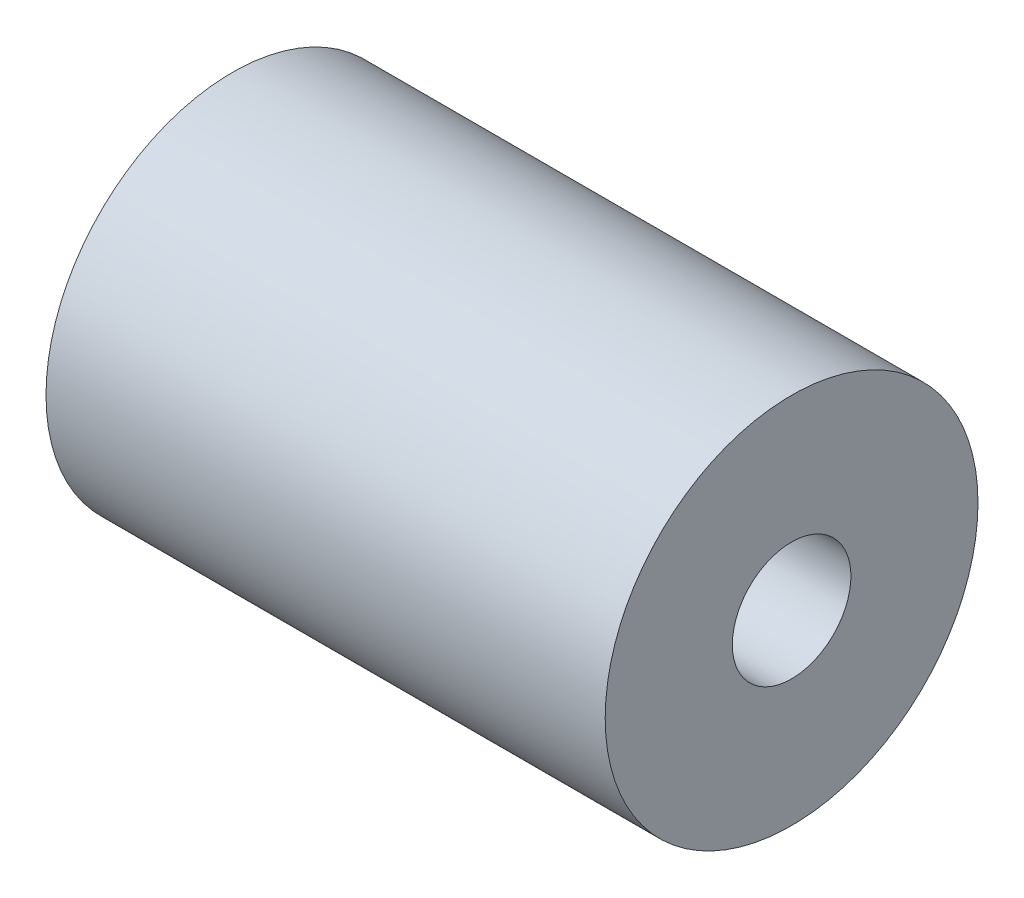
ISO-10303-21;
HEADER;
FILE_DESCRIPTION(('STEP AP214'),'2;1');
FILE_NAME('part.step','',(''),(''),'','','');
FILE_SCHEMA(('AUTOMOTIVE_DESIGN { 1 0 10303 214 1 1 1 1 }'));
ENDSEC;
DATA;
#1=APPLICATION_CONTEXT('core data for automotive mechanical design processes');
#2=APPLICATION_PROTOCOL_DEFINITION('international standard','automotive_design',2000,#1);
#3=PRODUCT_CONTEXT('',#1,'mechanical');
#4=PRODUCT('Part','Part','',(#3));
#5=PRODUCT_RELATED_PRODUCT_CATEGORY('part','',(#4));
#6=PRODUCT_DEFINITION_FORMATION('','',#4);
#7=PRODUCT_DEFINITION_CONTEXT('part definition',#1,'design');
#8=PRODUCT_DEFINITION('design','',#6,#7);
#9=PRODUCT_DEFINITION_SHAPE('','',#8);
#10=(LENGTH_UNIT() NAMED_UNIT(*) SI_UNIT(.MILLI.,.METRE.));
#11=(NAMED_UNIT(*) PLANE_ANGLE_UNIT() SI_UNIT($,.RADIAN.));
#12=(NAMED_UNIT(*) SI_UNIT($,.STERADIAN.) SOLID_ANGLE_UNIT());
#13=UNCERTAINTY_MEASURE_WITH_UNIT(LENGTH_MEASURE(1.E-05),#10,'distance_accuracy_value','');
#14=(GEOMETRIC_REPRESENTATION_CONTEXT(3) GLOBAL_UNCERTAINTY_ASSIGNED_CONTEXT((#13)) GLOBAL_UNIT_ASSIGNED_CONTEXT((#10,
#11,#12)) REPRESENTATION_CONTEXT('',''));
#15=CARTESIAN_POINT('',(0.,0.,0.));
#16=DIRECTION('',(0.,0.,1.));
#17=DIRECTION('',(1.,0.,0.));
#18=AXIS2_PLACEMENT_3D('',#15,#16,#17);
#19=CARTESIAN_POINT('',(19.05,0.,0.));
#20=DIRECTION('',(1.,0.,0.));
#21=DIRECTION('',(0.,0.,-1.));
#22=AXIS2_PLACEMENT_3D('',#19,#20,#21);
#23=PLANE('',#22);
#24=CARTESIAN_POINT('',(19.05,0.,0.));
#25=DIRECTION('',(1.,0.,0.));
#26=DIRECTION('',(0.,0.,-1.));
#27=AXIS2_PLACEMENT_3D('',#24,#25,#26);
#28=CIRCLE('',#27,6.35);
#29=CARTESIAN_POINT('',(19.05,0.,6.35));
#30=VERTEX_POINT('',#29);
#31=EDGE_CURVE('E12',#30,#30,#28,.T.);
#32=ORIENTED_EDGE('',*,*,#31,.T.);
#33=EDGE_LOOP('',(#32));
#34=FACE_BOUND('',#33,.T.);
#35=CARTESIAN_POINT('',(19.05,0.,0.));
#36=DIRECTION('',(1.,0.,0.));
#37=DIRECTION('',(0.,0.,-1.));
#38=AXIS2_PLACEMENT_3D('',#35,#36,#37);
#39=CIRCLE('',#38,2.0193);
#40=CARTESIAN_POINT('',(19.05,0.,2.0193));
#41=VERTEX_POINT('',#40);
#42=EDGE_CURVE('E62',#41,#41,#39,.T.);
#43=ORIENTED_EDGE('',*,*,#42,.F.);
#44=EDGE_LOOP('',(#43));
#45=FACE_BOUND('',#44,.T.);
#46=ADVANCED_FACE('F48',(#34,#45),#23,.T.);
#47=CARTESIAN_POINT('',(0.,0.,0.));
#48=DIRECTION('',(1.,0.,0.));
#49=DIRECTION('',(0.,0.,-1.));
#50=AXIS2_PLACEMENT_3D('',#47,#48,#49);
#51=PLANE('',#50);
#52=CARTESIAN_POINT('',(0.,0.,0.));
#53=DIRECTION('',(1.,0.,0.));
#54=DIRECTION('',(0.,0.,-1.));
#55=AXIS2_PLACEMENT_3D('',#52,#53,#54);
#56=CIRCLE('',#55,6.35);
#57=CARTESIAN_POINT('',(0.,0.,6.35));
#58=VERTEX_POINT('',#57);
#59=EDGE_CURVE('E52',#58,#58,#56,.T.);
#60=ORIENTED_EDGE('',*,*,#59,.F.);
#61=EDGE_LOOP('',(#60));
#62=FACE_BOUND('',#61,.T.);
#63=CARTESIAN_POINT('',(0.,0.,0.));
#64=DIRECTION('',(1.,0.,0.));
#65=DIRECTION('',(0.,0.,-1.));
#66=AXIS2_PLACEMENT_3D('',#63,#64,#65);
#67=CIRCLE('',#66,2.0193);
#68=CARTESIAN_POINT('',(0.,0.,2.0193));
#69=VERTEX_POINT('',#68);
#70=EDGE_CURVE('E64',#69,#69,#67,.T.);
#71=ORIENTED_EDGE('',*,*,#70,.T.);
#72=EDGE_LOOP('',(#71));
#73=FACE_BOUND('',#72,.T.);
#74=ADVANCED_FACE('F77',(#62,#73),#51,.F.);
#75=CARTESIAN_POINT('',(19.05,0.,0.));
#76=DIRECTION('',(-1.,0.,0.));
#77=DIRECTION('',(0.,0.,1.));
#78=AXIS2_PLACEMENT_3D('',#75,#76,#77);
#79=CYLINDRICAL_SURFACE('',#78,6.35);
#80=CARTESIAN_POINT('',(19.05,0.,6.35));
#81=CARTESIAN_POINT('',(18.8515625,0.,6.35));
#82=CARTESIAN_POINT('',(18.653125,0.,6.35));
#83=CARTESIAN_POINT('',(18.25625,0.,6.35));
#84=CARTESIAN_POINT('',(18.0578125,0.,6.35));
#85=CARTESIAN_POINT('',(17.6609375,0.,6.35));
#86=CARTESIAN_POINT('',(17.4625,0.,6.35));
#87=CARTESIAN_POINT('',(17.065625,0.,6.35));
#88=CARTESIAN_POINT('',(16.8671875,0.,6.35));
#89=CARTESIAN_POINT('',(16.4703125,0.,6.35));
#90=CARTESIAN_POINT('',(16.271875,0.,6.35));
#91=CARTESIAN_POINT('',(15.875,0.,6.35));
#92=CARTESIAN_POINT('',(15.6765625,0.,6.35));
#93=CARTESIAN_POINT('',(15.2796875,0.,6.35));
#94=CARTESIAN_POINT('',(15.08125,0.,6.35));
#95=CARTESIAN_POINT('',(14.684375,0.,6.35));
#96=CARTESIAN_POINT('',(14.4859375,0.,6.35));
#97=CARTESIAN_POINT('',(14.0890625,0.,6.35));
#98=CARTESIAN_POINT('',(13.890625,0.,6.35));
#99=CARTESIAN_POINT('',(13.49375,0.,6.35));
#100=CARTESIAN_POINT('',(13.2953125,0.,6.35));
#101=CARTESIAN_POINT('',(12.8984375,0.,6.35));
#102=CARTESIAN_POINT('',(12.7,0.,6.35));
#103=CARTESIAN_POINT('',(12.303125,0.,6.35));
#104=CARTESIAN_POINT('',(12.1046875,0.,6.35));
#105=CARTESIAN_POINT('',(11.7078125,0.,6.35));
#106=CARTESIAN_POINT('',(11.509375,0.,6.35));
#107=CARTESIAN_POINT('',(11.1125,0.,6.35));
#108=CARTESIAN_POINT('',(10.9140625,0.,6.35));
#109=CARTESIAN_POINT('',(10.5171875,0.,6.35));
#110=CARTESIAN_POINT('',(10.31875,0.,6.35));
#111=CARTESIAN_POINT('',(9.921875,0.,6.35));
#112=CARTESIAN_POINT('',(9.7234375,0.,6.35));
#113=CARTESIAN_POINT('',(9.3265625,0.,6.35));
#114=CARTESIAN_POINT('',(9.128125,0.,6.35));
#115=CARTESIAN_POINT('',(8.73125,0.,6.35));
#116=CARTESIAN_POINT('',(8.5328125,0.,6.35));
#117=CARTESIAN_POINT('',(8.1359375,0.,6.35));
#118=CARTESIAN_POINT('',(7.9375,0.,6.35));
#119=CARTESIAN_POINT('',(7.540625,0.,6.35));
#120=CARTESIAN_POINT('',(7.3421875,0.,6.35));
#121=CARTESIAN_POINT('',(6.9453125,0.,6.35));
#122=CARTESIAN_POINT('',(6.746875,0.,6.35));
#123=CARTESIAN_POINT('',(6.35,0.,6.35));
#124=CARTESIAN_POINT('',(6.1515625,0.,6.35));
#125=CARTESIAN_POINT('',(5.7546875,0.,6.35));
#126=CARTESIAN_POINT('',(5.55625,0.,6.35));
#127=CARTESIAN_POINT('',(5.159375,0.,6.35));
#128=CARTESIAN_POINT('',(4.9609375,0.,6.35));
#129=CARTESIAN_POINT('',(4.5640625,0.,6.35));
#130=CARTESIAN_POINT('',(4.365625,0.,6.35));
#131=CARTESIAN_POINT('',(3.96875,0.,6.35));
#132=CARTESIAN_POINT('',(3.7703125,0.,6.35));
#133=CARTESIAN_POINT('',(3.3734375,0.,6.35));
#134=CARTESIAN_POINT('',(3.175,0.,6.35));
#135=CARTESIAN_POINT('',(2.778125,0.,6.35));
#136=CARTESIAN_POINT('',(2.5796875,0.,6.35));
#137=CARTESIAN_POINT('',(2.1828125,0.,6.35));
#138=CARTESIAN_POINT('',(1.984375,0.,6.35));
#139=CARTESIAN_POINT('',(1.5875,0.,6.35));
#140=CARTESIAN_POINT('',(1.3890625,0.,6.35));
#141=CARTESIAN_POINT('',(0.992187500000001,0.,6.35));
#142=CARTESIAN_POINT('',(0.793750000000001,0.,6.35));
#143=CARTESIAN_POINT('',(0.396875,0.,6.35));
#144=CARTESIAN_POINT('',(0.1984375,0.,6.35));
#145=CARTESIAN_POINT('',(0.,0.,6.35));
#146=B_SPLINE_CURVE_WITH_KNOTS('',3,(#80,#81,#82,#83,#84,#85,#86,#87,#88,#89,#90,#91,#92,#93,
#94,#95,#96,#97,#98,#99,#100,#101,#102,#103,#104,#105,#106,#107,#108,#109,#110,#111,#112,#113,
#114,#115,#116,#117,#118,#119,#120,#121,#122,#123,#124,#125,#126,#127,#128,#129,#130,#131,#132,
#133,#134,#135,#136,#137,#138,#139,#140,#141,#142,#143,#144,#145),.UNSPECIFIED.,.F.,.F.,(4,2,2,
2,2,2,2,2,2,2,2,2,2,2,2,2,2,2,2,2,2,2,2,2,2,2,2,2,2,2,2,2,4),(0.,0.5953125,1.190625,1.7859375,
2.38125,2.9765625,3.571875,4.1671875,4.7625,5.3578125,5.953125,6.5484375,7.14375,7.7390625,
8.334375,8.9296875,9.525,10.1203125,10.715625,11.3109375,11.90625,12.5015625,13.096875,
13.6921875,14.2875,14.8828125,15.478125,16.0734375,16.66875,17.2640625,17.859375,18.4546875,
19.05),.UNSPECIFIED.);
#147=EDGE_CURVE('BSEAM50',#30,#58,#146,.T.);
#148=ORIENTED_EDGE('',*,*,#31,.F.);
#149=ORIENTED_EDGE('',*,*,#59,.T.);
#150=ORIENTED_EDGE('',*,*,#147,.T.);
#151=ORIENTED_EDGE('',*,*,#147,.F.);
#152=EDGE_LOOP('',(#148,#150,#149,#151));
#153=FACE_BOUND('',#152,.T.);
#154=ADVANCED_FACE('F50',(#153),#79,.T.);
#155=CARTESIAN_POINT('',(19.05,0.,0.));
#156=DIRECTION('',(-1.,0.,0.));
#157=DIRECTION('',(0.,0.,1.));
#158=AXIS2_PLACEMENT_3D('',#155,#156,#157);
#159=CYLINDRICAL_SURFACE('',#158,2.0193);
#160=CARTESIAN_POINT('',(19.05,0.,2.0193));
#161=CARTESIAN_POINT('',(18.8515625,0.,2.0193));
#162=CARTESIAN_POINT('',(18.653125,0.,2.0193));
#163=CARTESIAN_POINT('',(18.25625,0.,2.0193));
#164=CARTESIAN_POINT('',(18.0578125,0.,2.0193));
#165=CARTESIAN_POINT('',(17.6609375,0.,2.0193));
#166=CARTESIAN_POINT('',(17.4625,0.,2.0193));
#167=CARTESIAN_POINT('',(17.065625,0.,2.0193));
#168=CARTESIAN_POINT('',(16.8671875,0.,2.0193));
#169=CARTESIAN_POINT('',(16.4703125,0.,2.0193));
#170=CARTESIAN_POINT('',(16.271875,0.,2.0193));
#171=CARTESIAN_POINT('',(15.875,0.,2.0193));
#172=CARTESIAN_POINT('',(15.6765625,0.,2.0193));
#173=CARTESIAN_POINT('',(15.2796875,0.,2.0193));
#174=CARTESIAN_POINT('',(15.08125,0.,2.0193));
#175=CARTESIAN_POINT('',(14.684375,0.,2.0193));
#176=CARTESIAN_POINT('',(14.4859375,0.,2.0193));
#177=CARTESIAN_POINT('',(14.0890625,0.,2.0193));
#178=CARTESIAN_POINT('',(13.890625,0.,2.0193));
#179=CARTESIAN_POINT('',(13.49375,0.,2.0193));
#180=CARTESIAN_POINT('',(13.2953125,0.,2.0193));
#181=CARTESIAN_POINT('',(12.8984375,0.,2.0193));
#182=CARTESIAN_POINT('',(12.7,0.,2.0193));
#183=CARTESIAN_POINT('',(12.303125,0.,2.0193));
#184=CARTESIAN_POINT('',(12.1046875,0.,2.0193));
#185=CARTESIAN_POINT('',(11.7078125,0.,2.0193));
#186=CARTESIAN_POINT('',(11.509375,0.,2.0193));
#187=CARTESIAN_POINT('',(11.1125,0.,2.0193));
#188=CARTESIAN_POINT('',(10.9140625,0.,2.0193));
#189=CARTESIAN_POINT('',(10.5171875,0.,2.0193));
#190=CARTESIAN_POINT('',(10.31875,0.,2.0193));
#191=CARTESIAN_POINT('',(9.921875,0.,2.0193));
#192=CARTESIAN_POINT('',(9.7234375,0.,2.0193));
#193=CARTESIAN_POINT('',(9.3265625,0.,2.0193));
#194=CARTESIAN_POINT('',(9.128125,0.,2.0193));
#195=CARTESIAN_POINT('',(8.73125,0.,2.0193));
#196=CARTESIAN_POINT('',(8.5328125,0.,2.0193));
#197=CARTESIAN_POINT('',(8.1359375,0.,2.0193));
#198=CARTESIAN_POINT('',(7.9375,0.,2.0193));
#199=CARTESIAN_POINT('',(7.540625,0.,2.0193));
#200=CARTESIAN_POINT('',(7.3421875,0.,2.0193));
#201=CARTESIAN_POINT('',(6.9453125,0.,2.0193));
#202=CARTESIAN_POINT('',(6.746875,0.,2.0193));
#203=CARTESIAN_POINT('',(6.35,0.,2.0193));
#204=CARTESIAN_POINT('',(6.1515625,0.,2.0193));
#205=CARTESIAN_POINT('',(5.7546875,0.,2.0193));
#206=CARTESIAN_POINT('',(5.55625,0.,2.0193));
#207=CARTESIAN_POINT('',(5.159375,0.,2.0193));
#208=CARTESIAN_POINT('',(4.9609375,0.,2.0193));
#209=CARTESIAN_POINT('',(4.5640625,0.,2.0193));
#210=CARTESIAN_POINT('',(4.365625,0.,2.0193));
#211=CARTESIAN_POINT('',(3.96875,0.,2.0193));
#212=CARTESIAN_POINT('',(3.7703125,0.,2.0193));
#213=CARTESIAN_POINT('',(3.3734375,0.,2.0193));
#214=CARTESIAN_POINT('',(3.175,0.,2.0193));
#215=CARTESIAN_POINT('',(2.778125,0.,2.0193));
#216=CARTESIAN_POINT('',(2.5796875,0.,2.0193));
#217=CARTESIAN_POINT('',(2.1828125,0.,2.0193));
#218=CARTESIAN_POINT('',(1.984375,0.,2.0193));
#219=CARTESIAN_POINT('',(1.5875,0.,2.0193));
#220=CARTESIAN_POINT('',(1.3890625,0.,2.0193));
#221=CARTESIAN_POINT('',(0.992187500000001,0.,2.0193));
#222=CARTESIAN_POINT('',(0.793750000000001,0.,2.0193));
#223=CARTESIAN_POINT('',(0.396875,0.,2.0193));
#224=CARTESIAN_POINT('',(0.1984375,0.,2.0193));
#225=CARTESIAN_POINT('',(0.,0.,2.0193));
#226=B_SPLINE_CURVE_WITH_KNOTS('',3,(#160,#161,#162,#163,#164,#165,#166,#167,#168,#169,#170,
#171,#172,#173,#174,#175,#176,#177,#178,#179,#180,#181,#182,#183,#184,#185,#186,#187,#188,#189,
#190,#191,#192,#193,#194,#195,#196,#197,#198,#199,#200,#201,#202,#203,#204,#205,#206,#207,#208,
#209,#210,#211,#212,#213,#214,#215,#216,#217,#218,#219,#220,#221,#222,#223,#224,#225),
.UNSPECIFIED.,.F.,.F.,(4,2,2,2,2,2,2,2,2,2,2,2,2,2,2,2,2,2,2,2,2,2,2,2,2,2,2,2,2,2,2,2,4),(0.,
0.5953125,1.190625,1.7859375,2.38125,2.9765625,3.571875,4.1671875,4.7625,5.3578125,5.953125,
6.5484375,7.14375,7.7390625,8.334375,8.9296875,9.525,10.1203125,10.715625,11.3109375,11.90625,
12.5015625,13.096875,13.6921875,14.2875,14.8828125,15.478125,16.0734375,16.66875,17.2640625,
17.859375,18.4546875,19.05),.UNSPECIFIED.);
#227=EDGE_CURVE('BSEAM73',#41,#69,#226,.T.);
#228=ORIENTED_EDGE('',*,*,#42,.T.);
#229=ORIENTED_EDGE('',*,*,#70,.F.);
#230=ORIENTED_EDGE('',*,*,#227,.T.);
#231=ORIENTED_EDGE('',*,*,#227,.F.);
#232=EDGE_LOOP('',(#228,#230,#229,#231));
#233=FACE_BOUND('',#232,.T.);
#234=ADVANCED_FACE('F73',(#233),#159,.F.);
#235=CLOSED_SHELL('',(#46,#74,#154,#234));
#236=MANIFOLD_SOLID_BREP('B2',#235);
#237=ADVANCED_BREP_SHAPE_REPRESENTATION('',(#18,#236),#14);
#238=SHAPE_DEFINITION_REPRESENTATION(#9,#237);
ENDSEC;
END-ISO-10303-21;
